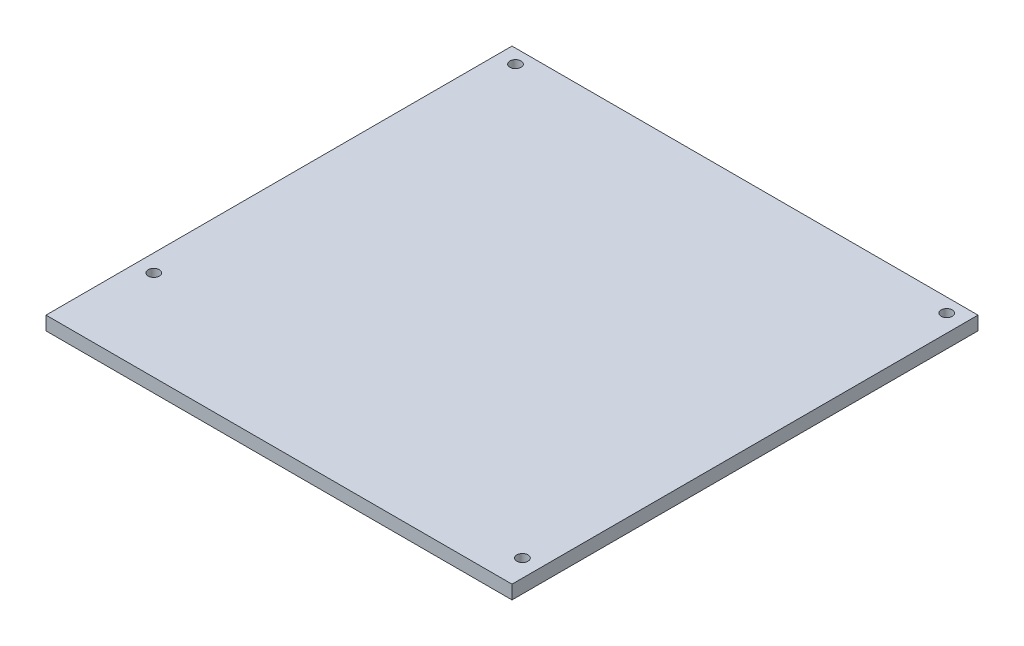
ISO-10303-21;
HEADER;
FILE_DESCRIPTION(('STEP AP214'),'2;1');
FILE_NAME('part.step','',(''),(''),'','','');
FILE_SCHEMA(('AUTOMOTIVE_DESIGN { 1 0 10303 214 1 1 1 1 }'));
ENDSEC;
DATA;
#1=APPLICATION_CONTEXT('core data for automotive mechanical design processes');
#2=APPLICATION_PROTOCOL_DEFINITION('international standard','automotive_design',2000,#1);
#3=PRODUCT_CONTEXT('',#1,'mechanical');
#4=PRODUCT('Part','Part','',(#3));
#5=PRODUCT_RELATED_PRODUCT_CATEGORY('part','',(#4));
#6=PRODUCT_DEFINITION_FORMATION('','',#4);
#7=PRODUCT_DEFINITION_CONTEXT('part definition',#1,'design');
#8=PRODUCT_DEFINITION('design','',#6,#7);
#9=PRODUCT_DEFINITION_SHAPE('','',#8);
#10=(LENGTH_UNIT() NAMED_UNIT(*) SI_UNIT(.MILLI.,.METRE.));
#11=(NAMED_UNIT(*) PLANE_ANGLE_UNIT() SI_UNIT($,.RADIAN.));
#12=(NAMED_UNIT(*) SI_UNIT($,.STERADIAN.) SOLID_ANGLE_UNIT());
#13=UNCERTAINTY_MEASURE_WITH_UNIT(LENGTH_MEASURE(1.E-05),#10,'distance_accuracy_value','');
#14=(GEOMETRIC_REPRESENTATION_CONTEXT(3) GLOBAL_UNCERTAINTY_ASSIGNED_CONTEXT((#13)) GLOBAL_UNIT_ASSIGNED_CONTEXT((#10,
#11,#12)) REPRESENTATION_CONTEXT('',''));
#15=CARTESIAN_POINT('',(0.,0.,0.));
#16=DIRECTION('',(0.,0.,1.));
#17=DIRECTION('',(1.,0.,0.));
#18=AXIS2_PLACEMENT_3D('',#15,#16,#17);
#19=CARTESIAN_POINT('',(85.09,0.,-85.09));
#20=DIRECTION('',(0.,-1.,0.));
#21=DIRECTION('',(0.,0.,-1.));
#22=AXIS2_PLACEMENT_3D('',#19,#20,#21);
#23=PLANE('',#22);
#24=CARTESIAN_POINT('',(78.74,0.,-80.01));
#25=DIRECTION('',(0.,1.,0.));
#26=DIRECTION('',(0.,0.,1.));
#27=AXIS2_PLACEMENT_3D('',#24,#25,#26);
#28=CIRCLE('',#27,2.03199999999999);
#29=CARTESIAN_POINT('',(78.74,0.,-77.978));
#30=VERTEX_POINT('',#29);
#31=EDGE_CURVE('E124',#30,#30,#28,.T.);
#32=ORIENTED_EDGE('',*,*,#31,.T.);
#33=EDGE_LOOP('',(#32));
#34=FACE_BOUND('',#33,.T.);
#35=DIRECTION('',(0.,0.,-1.));
#36=VECTOR('',#35,1.);
#37=CARTESIAN_POINT('',(85.09,0.,85.09));
#38=LINE('',#37,#36);
#39=CARTESIAN_POINT('',(85.09,0.,85.09));
#40=VERTEX_POINT('',#39);
#41=CARTESIAN_POINT('',(85.09,0.,-85.09));
#42=VERTEX_POINT('',#41);
#43=EDGE_CURVE('E99',#40,#42,#38,.T.);
#44=ORIENTED_EDGE('',*,*,#43,.F.);
#45=DIRECTION('',(1.,0.,0.));
#46=VECTOR('',#45,1.);
#47=CARTESIAN_POINT('',(-85.09,0.,85.09));
#48=LINE('',#47,#46);
#49=CARTESIAN_POINT('',(-85.09,0.,85.09));
#50=VERTEX_POINT('',#49);
#51=EDGE_CURVE('E74',#50,#40,#48,.T.);
#52=ORIENTED_EDGE('',*,*,#51,.F.);
#53=DIRECTION('',(0.,0.,1.));
#54=VECTOR('',#53,1.);
#55=CARTESIAN_POINT('',(-85.09,0.,85.09));
#56=LINE('',#55,#54);
#57=CARTESIAN_POINT('',(-85.09,0.,-85.09));
#58=VERTEX_POINT('',#57);
#59=EDGE_CURVE('E68',#58,#50,#56,.T.);
#60=ORIENTED_EDGE('',*,*,#59,.F.);
#61=DIRECTION('',(-1.,0.,0.));
#62=VECTOR('',#61,1.);
#63=CARTESIAN_POINT('',(-85.09,0.,-85.09));
#64=LINE('',#63,#62);
#65=EDGE_CURVE('E91',#42,#58,#64,.T.);
#66=ORIENTED_EDGE('',*,*,#65,.F.);
#67=EDGE_LOOP('',(#44,#52,#60,#66));
#68=FACE_BOUND('',#67,.T.);
#69=CARTESIAN_POINT('',(-78.74,0.,52.07));
#70=DIRECTION('',(0.,1.,0.));
#71=DIRECTION('',(0.,0.,1.));
#72=AXIS2_PLACEMENT_3D('',#69,#70,#71);
#73=CIRCLE('',#72,2.03199999999999);
#74=CARTESIAN_POINT('',(-78.74,0.,54.102));
#75=VERTEX_POINT('',#74);
#76=EDGE_CURVE('E102',#75,#75,#73,.T.);
#77=ORIENTED_EDGE('',*,*,#76,.T.);
#78=EDGE_LOOP('',(#77));
#79=FACE_BOUND('',#78,.T.);
#80=CARTESIAN_POINT('',(78.74,0.,74.93));
#81=DIRECTION('',(0.,1.,0.));
#82=DIRECTION('',(0.,0.,1.));
#83=AXIS2_PLACEMENT_3D('',#80,#81,#82);
#84=CIRCLE('',#83,2.03199999999999);
#85=CARTESIAN_POINT('',(78.74,0.,76.962));
#86=VERTEX_POINT('',#85);
#87=EDGE_CURVE('E118',#86,#86,#84,.T.);
#88=ORIENTED_EDGE('',*,*,#87,.T.);
#89=EDGE_LOOP('',(#88));
#90=FACE_BOUND('',#89,.T.);
#91=CARTESIAN_POINT('',(-78.74,0.,-80.01));
#92=DIRECTION('',(0.,1.,0.));
#93=DIRECTION('',(0.,0.,1.));
#94=AXIS2_PLACEMENT_3D('',#91,#92,#93);
#95=CIRCLE('',#94,2.03199999999999);
#96=CARTESIAN_POINT('',(-78.74,0.,-77.978));
#97=VERTEX_POINT('',#96);
#98=EDGE_CURVE('E130',#97,#97,#95,.T.);
#99=ORIENTED_EDGE('',*,*,#98,.T.);
#100=EDGE_LOOP('',(#99));
#101=FACE_BOUND('',#100,.T.);
#102=ADVANCED_FACE('F34',(#34,#68,#79,#90,#101),#23,.T.);
#103=CARTESIAN_POINT('',(85.09,5.,-85.09));
#104=DIRECTION('',(0.,-1.,0.));
#105=DIRECTION('',(0.,0.,-1.));
#106=AXIS2_PLACEMENT_3D('',#103,#104,#105);
#107=PLANE('',#106);
#108=CARTESIAN_POINT('',(78.74,5.,-80.01));
#109=DIRECTION('',(0.,1.,0.));
#110=DIRECTION('',(0.,0.,1.));
#111=AXIS2_PLACEMENT_3D('',#108,#109,#110);
#112=CIRCLE('',#111,2.03200000000001);
#113=CARTESIAN_POINT('',(78.74,5.,-77.978));
#114=VERTEX_POINT('',#113);
#115=EDGE_CURVE('E127',#114,#114,#112,.T.);
#116=ORIENTED_EDGE('',*,*,#115,.F.);
#117=EDGE_LOOP('',(#116));
#118=FACE_BOUND('',#117,.T.);
#119=DIRECTION('',(0.,0.,-1.));
#120=VECTOR('',#119,1.);
#121=CARTESIAN_POINT('',(85.09,5.,85.09));
#122=LINE('',#121,#120);
#123=CARTESIAN_POINT('',(85.09,5.,85.09));
#124=VERTEX_POINT('',#123);
#125=CARTESIAN_POINT('',(85.09,5.,-85.09));
#126=VERTEX_POINT('',#125);
#127=EDGE_CURVE('E87',#124,#126,#122,.T.);
#128=ORIENTED_EDGE('',*,*,#127,.T.);
#129=DIRECTION('',(-1.,0.,0.));
#130=VECTOR('',#129,1.);
#131=CARTESIAN_POINT('',(-85.09,5.,-85.09));
#132=LINE('',#131,#130);
#133=CARTESIAN_POINT('',(-85.09,5.,-85.09));
#134=VERTEX_POINT('',#133);
#135=EDGE_CURVE('E81',#126,#134,#132,.T.);
#136=ORIENTED_EDGE('',*,*,#135,.T.);
#137=DIRECTION('',(0.,0.,1.));
#138=VECTOR('',#137,1.);
#139=CARTESIAN_POINT('',(-85.09,5.,85.09));
#140=LINE('',#139,#138);
#141=CARTESIAN_POINT('',(-85.09,5.,85.09));
#142=VERTEX_POINT('',#141);
#143=EDGE_CURVE('E85',#134,#142,#140,.T.);
#144=ORIENTED_EDGE('',*,*,#143,.T.);
#145=DIRECTION('',(1.,0.,0.));
#146=VECTOR('',#145,1.);
#147=CARTESIAN_POINT('',(-85.09,5.,85.09));
#148=LINE('',#147,#146);
#149=EDGE_CURVE('E51',#142,#124,#148,.T.);
#150=ORIENTED_EDGE('',*,*,#149,.T.);
#151=EDGE_LOOP('',(#128,#136,#144,#150));
#152=FACE_BOUND('',#151,.T.);
#153=CARTESIAN_POINT('',(-78.74,5.,52.07));
#154=DIRECTION('',(0.,1.,0.));
#155=DIRECTION('',(0.,0.,1.));
#156=AXIS2_PLACEMENT_3D('',#153,#154,#155);
#157=CIRCLE('',#156,2.03200000000001);
#158=CARTESIAN_POINT('',(-78.74,5.,54.102));
#159=VERTEX_POINT('',#158);
#160=EDGE_CURVE('E115',#159,#159,#157,.T.);
#161=ORIENTED_EDGE('',*,*,#160,.F.);
#162=EDGE_LOOP('',(#161));
#163=FACE_BOUND('',#162,.T.);
#164=CARTESIAN_POINT('',(78.74,5.,74.93));
#165=DIRECTION('',(0.,1.,0.));
#166=DIRECTION('',(0.,0.,1.));
#167=AXIS2_PLACEMENT_3D('',#164,#165,#166);
#168=CIRCLE('',#167,2.03200000000001);
#169=CARTESIAN_POINT('',(78.74,5.,76.962));
#170=VERTEX_POINT('',#169);
#171=EDGE_CURVE('E121',#170,#170,#168,.T.);
#172=ORIENTED_EDGE('',*,*,#171,.F.);
#173=EDGE_LOOP('',(#172));
#174=FACE_BOUND('',#173,.T.);
#175=CARTESIAN_POINT('',(-78.74,5.,-80.01));
#176=DIRECTION('',(0.,1.,0.));
#177=DIRECTION('',(0.,0.,1.));
#178=AXIS2_PLACEMENT_3D('',#175,#176,#177);
#179=CIRCLE('',#178,2.03200000000001);
#180=CARTESIAN_POINT('',(-78.74,5.,-77.978));
#181=VERTEX_POINT('',#180);
#182=EDGE_CURVE('E133',#181,#181,#179,.T.);
#183=ORIENTED_EDGE('',*,*,#182,.F.);
#184=EDGE_LOOP('',(#183));
#185=FACE_BOUND('',#184,.T.);
#186=ADVANCED_FACE('F82',(#118,#152,#163,#174,#185),#107,.F.);
#187=CARTESIAN_POINT('',(85.09,5.,85.09));
#188=DIRECTION('',(-1.,0.,0.));
#189=DIRECTION('',(0.,0.,1.));
#190=AXIS2_PLACEMENT_3D('',#187,#188,#189);
#191=PLANE('',#190);
#192=ORIENTED_EDGE('',*,*,#43,.T.);
#193=DIRECTION('',(0.,-1.,0.));
#194=VECTOR('',#193,1.);
#195=CARTESIAN_POINT('',(85.09,5.,-85.09));
#196=LINE('',#195,#194);
#197=EDGE_CURVE('E11',#126,#42,#196,.T.);
#198=ORIENTED_EDGE('',*,*,#197,.F.);
#199=ORIENTED_EDGE('',*,*,#127,.F.);
#200=DIRECTION('',(0.,-1.,0.));
#201=VECTOR('',#200,1.);
#202=CARTESIAN_POINT('',(85.09,5.,85.09));
#203=LINE('',#202,#201);
#204=EDGE_CURVE('E95',#124,#40,#203,.T.);
#205=ORIENTED_EDGE('',*,*,#204,.T.);
#206=EDGE_LOOP('',(#192,#198,#199,#205));
#207=FACE_BOUND('',#206,.T.);
#208=ADVANCED_FACE('F36',(#207),#191,.F.);
#209=CARTESIAN_POINT('',(-85.09,5.,-85.09));
#210=DIRECTION('',(0.,0.,1.));
#211=DIRECTION('',(1.,0.,0.));
#212=AXIS2_PLACEMENT_3D('',#209,#210,#211);
#213=PLANE('',#212);
#214=ORIENTED_EDGE('',*,*,#65,.T.);
#215=DIRECTION('',(0.,-1.,0.));
#216=VECTOR('',#215,1.);
#217=CARTESIAN_POINT('',(-85.09,5.,-85.09));
#218=LINE('',#217,#216);
#219=EDGE_CURVE('E43',#134,#58,#218,.T.);
#220=ORIENTED_EDGE('',*,*,#219,.F.);
#221=ORIENTED_EDGE('',*,*,#135,.F.);
#222=ORIENTED_EDGE('',*,*,#197,.T.);
#223=EDGE_LOOP('',(#214,#220,#221,#222));
#224=FACE_BOUND('',#223,.T.);
#225=ADVANCED_FACE('F90',(#224),#213,.F.);
#226=CARTESIAN_POINT('',(-85.09,5.,85.09));
#227=DIRECTION('',(1.,0.,0.));
#228=DIRECTION('',(0.,0.,-1.));
#229=AXIS2_PLACEMENT_3D('',#226,#227,#228);
#230=PLANE('',#229);
#231=ORIENTED_EDGE('',*,*,#59,.T.);
#232=DIRECTION('',(0.,-1.,0.));
#233=VECTOR('',#232,1.);
#234=CARTESIAN_POINT('',(-85.09,5.,85.09));
#235=LINE('',#234,#233);
#236=EDGE_CURVE('E92',#142,#50,#235,.T.);
#237=ORIENTED_EDGE('',*,*,#236,.F.);
#238=ORIENTED_EDGE('',*,*,#143,.F.);
#239=ORIENTED_EDGE('',*,*,#219,.T.);
#240=EDGE_LOOP('',(#231,#237,#238,#239));
#241=FACE_BOUND('',#240,.T.);
#242=ADVANCED_FACE('F93',(#241),#230,.F.);
#243=CARTESIAN_POINT('',(-85.09,5.,85.09));
#244=DIRECTION('',(0.,0.,-1.));
#245=DIRECTION('',(-1.,0.,0.));
#246=AXIS2_PLACEMENT_3D('',#243,#244,#245);
#247=PLANE('',#246);
#248=ORIENTED_EDGE('',*,*,#51,.T.);
#249=ORIENTED_EDGE('',*,*,#204,.F.);
#250=ORIENTED_EDGE('',*,*,#149,.F.);
#251=ORIENTED_EDGE('',*,*,#236,.T.);
#252=EDGE_LOOP('',(#248,#249,#250,#251));
#253=FACE_BOUND('',#252,.T.);
#254=ADVANCED_FACE('F107',(#253),#247,.F.);
#255=CARTESIAN_POINT('',(-78.74,5.,52.07));
#256=DIRECTION('',(0.,1.,0.));
#257=DIRECTION('',(0.,0.,1.));
#258=AXIS2_PLACEMENT_3D('',#255,#256,#257);
#259=CYLINDRICAL_SURFACE('',#258,2.032);
#260=ORIENTED_EDGE('',*,*,#76,.F.);
#261=EDGE_LOOP('',(#260));
#262=FACE_BOUND('',#261,.T.);
#263=ORIENTED_EDGE('',*,*,#160,.T.);
#264=EDGE_LOOP('',(#263));
#265=FACE_BOUND('',#264,.T.);
#266=ADVANCED_FACE('F150',(#262,#265),#259,.F.);
#267=CARTESIAN_POINT('',(78.74,5.,74.93));
#268=DIRECTION('',(0.,1.,0.));
#269=DIRECTION('',(0.,0.,1.));
#270=AXIS2_PLACEMENT_3D('',#267,#268,#269);
#271=CYLINDRICAL_SURFACE('',#270,2.032);
#272=ORIENTED_EDGE('',*,*,#87,.F.);
#273=EDGE_LOOP('',(#272));
#274=FACE_BOUND('',#273,.T.);
#275=ORIENTED_EDGE('',*,*,#171,.T.);
#276=EDGE_LOOP('',(#275));
#277=FACE_BOUND('',#276,.T.);
#278=ADVANCED_FACE('F176',(#274,#277),#271,.F.);
#279=CARTESIAN_POINT('',(78.74,5.,-80.01));
#280=DIRECTION('',(0.,1.,0.));
#281=DIRECTION('',(0.,0.,1.));
#282=AXIS2_PLACEMENT_3D('',#279,#280,#281);
#283=CYLINDRICAL_SURFACE('',#282,2.032);
#284=ORIENTED_EDGE('',*,*,#31,.F.);
#285=EDGE_LOOP('',(#284));
#286=FACE_BOUND('',#285,.T.);
#287=ORIENTED_EDGE('',*,*,#115,.T.);
#288=EDGE_LOOP('',(#287));
#289=FACE_BOUND('',#288,.T.);
#290=ADVANCED_FACE('F184',(#286,#289),#283,.F.);
#291=CARTESIAN_POINT('',(-78.74,5.,-80.01));
#292=DIRECTION('',(0.,1.,0.));
#293=DIRECTION('',(0.,0.,1.));
#294=AXIS2_PLACEMENT_3D('',#291,#292,#293);
#295=CYLINDRICAL_SURFACE('',#294,2.032);
#296=ORIENTED_EDGE('',*,*,#98,.F.);
#297=EDGE_LOOP('',(#296));
#298=FACE_BOUND('',#297,.T.);
#299=ORIENTED_EDGE('',*,*,#182,.T.);
#300=EDGE_LOOP('',(#299));
#301=FACE_BOUND('',#300,.T.);
#302=ADVANCED_FACE('F137',(#298,#301),#295,.F.);
#303=CLOSED_SHELL('',(#102,#186,#208,#225,#242,#254,#266,#278,#290,#302));
#304=MANIFOLD_SOLID_BREP('B2',#303);
#305=ADVANCED_BREP_SHAPE_REPRESENTATION('',(#18,#304),#14);
#306=SHAPE_DEFINITION_REPRESENTATION(#9,#305);
ENDSEC;
END-ISO-10303-21;
